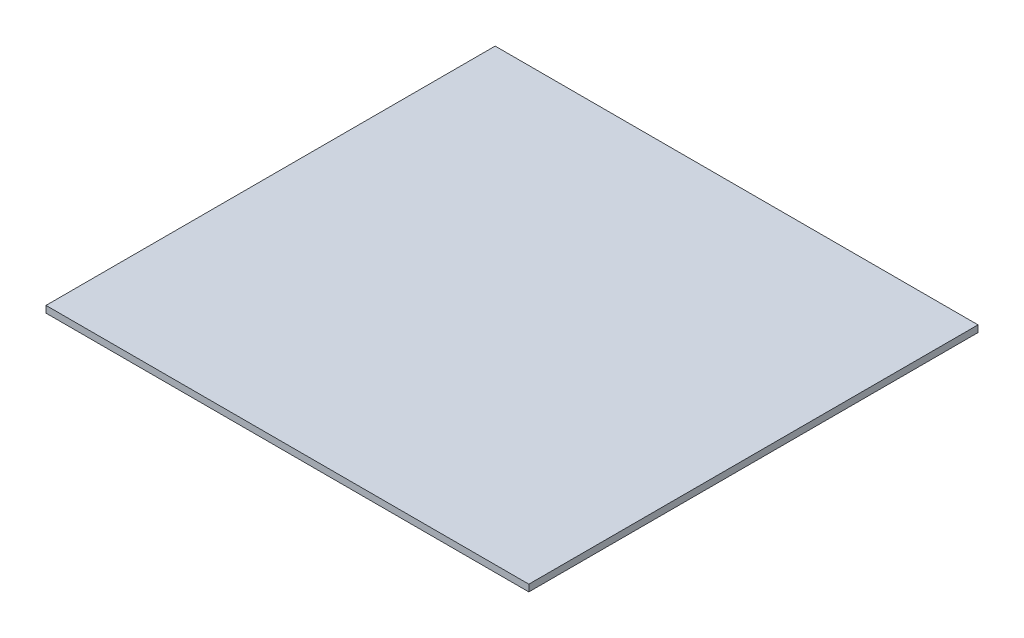
ISO-10303-21;
HEADER;
FILE_DESCRIPTION(('STEP AP214'),'2;1');
FILE_NAME('part.step','',(''),(''),'','','');
FILE_SCHEMA(('AUTOMOTIVE_DESIGN { 1 0 10303 214 1 1 1 1 }'));
ENDSEC;
DATA;
#1=APPLICATION_CONTEXT('core data for automotive mechanical design processes');
#2=APPLICATION_PROTOCOL_DEFINITION('international standard','automotive_design',2000,#1);
#3=PRODUCT_CONTEXT('',#1,'mechanical');
#4=PRODUCT('Part','Part','',(#3));
#5=PRODUCT_RELATED_PRODUCT_CATEGORY('part','',(#4));
#6=PRODUCT_DEFINITION_FORMATION('','',#4);
#7=PRODUCT_DEFINITION_CONTEXT('part definition',#1,'design');
#8=PRODUCT_DEFINITION('design','',#6,#7);
#9=PRODUCT_DEFINITION_SHAPE('','',#8);
#10=(LENGTH_UNIT() NAMED_UNIT(*) SI_UNIT(.MILLI.,.METRE.));
#11=(NAMED_UNIT(*) PLANE_ANGLE_UNIT() SI_UNIT($,.RADIAN.));
#12=(NAMED_UNIT(*) SI_UNIT($,.STERADIAN.) SOLID_ANGLE_UNIT());
#13=UNCERTAINTY_MEASURE_WITH_UNIT(LENGTH_MEASURE(1.E-05),#10,'distance_accuracy_value','');
#14=(GEOMETRIC_REPRESENTATION_CONTEXT(3) GLOBAL_UNCERTAINTY_ASSIGNED_CONTEXT((#13)) GLOBAL_UNIT_ASSIGNED_CONTEXT((#10,
#11,#12)) REPRESENTATION_CONTEXT('',''));
#15=CARTESIAN_POINT('',(0.,0.,0.));
#16=DIRECTION('',(0.,0.,1.));
#17=DIRECTION('',(1.,0.,0.));
#18=AXIS2_PLACEMENT_3D('',#15,#16,#17);
#19=CARTESIAN_POINT('',(215.,3.,200.));
#20=DIRECTION('',(-1.,0.,0.));
#21=DIRECTION('',(0.,0.,1.));
#22=AXIS2_PLACEMENT_3D('',#19,#20,#21);
#23=PLANE('',#22);
#24=DIRECTION('',(0.,0.,-1.));
#25=VECTOR('',#24,1.);
#26=CARTESIAN_POINT('',(215.,-3.,200.));
#27=LINE('',#26,#25);
#28=CARTESIAN_POINT('',(215.,-3.,200.));
#29=VERTEX_POINT('',#28);
#30=CARTESIAN_POINT('',(215.,-3.,-200.));
#31=VERTEX_POINT('',#30);
#32=EDGE_CURVE('E96',#29,#31,#27,.T.);
#33=ORIENTED_EDGE('',*,*,#32,.T.);
#34=DIRECTION('',(0.,-1.,0.));
#35=VECTOR('',#34,1.);
#36=CARTESIAN_POINT('',(215.,3.,-200.));
#37=LINE('',#36,#35);
#38=CARTESIAN_POINT('',(215.,3.,-200.));
#39=VERTEX_POINT('',#38);
#40=EDGE_CURVE('E11',#39,#31,#37,.T.);
#41=ORIENTED_EDGE('',*,*,#40,.F.);
#42=DIRECTION('',(0.,0.,-1.));
#43=VECTOR('',#42,1.);
#44=CARTESIAN_POINT('',(215.,3.,200.));
#45=LINE('',#44,#43);
#46=CARTESIAN_POINT('',(215.,3.,200.));
#47=VERTEX_POINT('',#46);
#48=EDGE_CURVE('E84',#47,#39,#45,.T.);
#49=ORIENTED_EDGE('',*,*,#48,.F.);
#50=DIRECTION('',(0.,-1.,0.));
#51=VECTOR('',#50,1.);
#52=CARTESIAN_POINT('',(215.,3.,200.));
#53=LINE('',#52,#51);
#54=EDGE_CURVE('E92',#47,#29,#53,.T.);
#55=ORIENTED_EDGE('',*,*,#54,.T.);
#56=EDGE_LOOP('',(#33,#41,#49,#55));
#57=FACE_BOUND('',#56,.T.);
#58=ADVANCED_FACE('F33',(#57),#23,.F.);
#59=CARTESIAN_POINT('',(-215.,3.,-200.));
#60=DIRECTION('',(0.,0.,1.));
#61=DIRECTION('',(1.,0.,0.));
#62=AXIS2_PLACEMENT_3D('',#59,#60,#61);
#63=PLANE('',#62);
#64=DIRECTION('',(-1.,0.,0.));
#65=VECTOR('',#64,1.);
#66=CARTESIAN_POINT('',(-215.,-3.,-200.));
#67=LINE('',#66,#65);
#68=CARTESIAN_POINT('',(-215.,-3.,-200.));
#69=VERTEX_POINT('',#68);
#70=EDGE_CURVE('E88',#31,#69,#67,.T.);
#71=ORIENTED_EDGE('',*,*,#70,.T.);
#72=DIRECTION('',(0.,-1.,0.));
#73=VECTOR('',#72,1.);
#74=CARTESIAN_POINT('',(-215.,3.,-200.));
#75=LINE('',#74,#73);
#76=CARTESIAN_POINT('',(-215.,3.,-200.));
#77=VERTEX_POINT('',#76);
#78=EDGE_CURVE('E41',#77,#69,#75,.T.);
#79=ORIENTED_EDGE('',*,*,#78,.F.);
#80=DIRECTION('',(-1.,0.,0.));
#81=VECTOR('',#80,1.);
#82=CARTESIAN_POINT('',(-215.,3.,-200.));
#83=LINE('',#82,#81);
#84=EDGE_CURVE('E79',#39,#77,#83,.T.);
#85=ORIENTED_EDGE('',*,*,#84,.F.);
#86=ORIENTED_EDGE('',*,*,#40,.T.);
#87=EDGE_LOOP('',(#71,#79,#85,#86));
#88=FACE_BOUND('',#87,.T.);
#89=ADVANCED_FACE('F87',(#88),#63,.F.);
#90=CARTESIAN_POINT('',(-215.,3.,200.));
#91=DIRECTION('',(1.,0.,0.));
#92=DIRECTION('',(0.,0.,-1.));
#93=AXIS2_PLACEMENT_3D('',#90,#91,#92);
#94=PLANE('',#93);
#95=DIRECTION('',(0.,0.,1.));
#96=VECTOR('',#95,1.);
#97=CARTESIAN_POINT('',(-215.,-3.,200.));
#98=LINE('',#97,#96);
#99=CARTESIAN_POINT('',(-215.,-3.,200.));
#100=VERTEX_POINT('',#99);
#101=EDGE_CURVE('E66',#69,#100,#98,.T.);
#102=ORIENTED_EDGE('',*,*,#101,.T.);
#103=DIRECTION('',(0.,-1.,0.));
#104=VECTOR('',#103,1.);
#105=CARTESIAN_POINT('',(-215.,3.,200.));
#106=LINE('',#105,#104);
#107=CARTESIAN_POINT('',(-215.,3.,200.));
#108=VERTEX_POINT('',#107);
#109=EDGE_CURVE('E89',#108,#100,#106,.T.);
#110=ORIENTED_EDGE('',*,*,#109,.F.);
#111=DIRECTION('',(0.,0.,1.));
#112=VECTOR('',#111,1.);
#113=CARTESIAN_POINT('',(-215.,3.,200.));
#114=LINE('',#113,#112);
#115=EDGE_CURVE('E82',#77,#108,#114,.T.);
#116=ORIENTED_EDGE('',*,*,#115,.F.);
#117=ORIENTED_EDGE('',*,*,#78,.T.);
#118=EDGE_LOOP('',(#102,#110,#116,#117));
#119=FACE_BOUND('',#118,.T.);
#120=ADVANCED_FACE('F90',(#119),#94,.F.);
#121=CARTESIAN_POINT('',(-215.,3.,200.));
#122=DIRECTION('',(0.,0.,-1.));
#123=DIRECTION('',(-1.,0.,0.));
#124=AXIS2_PLACEMENT_3D('',#121,#122,#123);
#125=PLANE('',#124);
#126=DIRECTION('',(1.,0.,0.));
#127=VECTOR('',#126,1.);
#128=CARTESIAN_POINT('',(-215.,-3.,200.));
#129=LINE('',#128,#127);
#130=EDGE_CURVE('E72',#100,#29,#129,.T.);
#131=ORIENTED_EDGE('',*,*,#130,.T.);
#132=ORIENTED_EDGE('',*,*,#54,.F.);
#133=DIRECTION('',(1.,0.,0.));
#134=VECTOR('',#133,1.);
#135=CARTESIAN_POINT('',(-215.,3.,200.));
#136=LINE('',#135,#134);
#137=EDGE_CURVE('E49',#108,#47,#136,.T.);
#138=ORIENTED_EDGE('',*,*,#137,.F.);
#139=ORIENTED_EDGE('',*,*,#109,.T.);
#140=EDGE_LOOP('',(#131,#132,#138,#139));
#141=FACE_BOUND('',#140,.T.);
#142=ADVANCED_FACE('F103',(#141),#125,.F.);
#143=CARTESIAN_POINT('',(0.,3.,0.));
#144=DIRECTION('',(0.,-1.,0.));
#145=DIRECTION('',(0.,0.,-1.));
#146=AXIS2_PLACEMENT_3D('',#143,#144,#145);
#147=PLANE('',#146);
#148=ORIENTED_EDGE('',*,*,#48,.T.);
#149=ORIENTED_EDGE('',*,*,#84,.T.);
#150=ORIENTED_EDGE('',*,*,#115,.T.);
#151=ORIENTED_EDGE('',*,*,#137,.T.);
#152=EDGE_LOOP('',(#148,#149,#150,#151));
#153=FACE_BOUND('',#152,.T.);
#154=ADVANCED_FACE('F80',(#153),#147,.F.);
#155=CARTESIAN_POINT('',(0.,-3.,0.));
#156=DIRECTION('',(0.,-1.,0.));
#157=DIRECTION('',(0.,0.,-1.));
#158=AXIS2_PLACEMENT_3D('',#155,#156,#157);
#159=PLANE('',#158);
#160=ORIENTED_EDGE('',*,*,#32,.F.);
#161=ORIENTED_EDGE('',*,*,#130,.F.);
#162=ORIENTED_EDGE('',*,*,#101,.F.);
#163=ORIENTED_EDGE('',*,*,#70,.F.);
#164=EDGE_LOOP('',(#160,#161,#162,#163));
#165=FACE_BOUND('',#164,.T.);
#166=ADVANCED_FACE('F106',(#165),#159,.T.);
#167=CLOSED_SHELL('',(#58,#89,#120,#142,#154,#166));
#168=MANIFOLD_SOLID_BREP('B2',#167);
#169=ADVANCED_BREP_SHAPE_REPRESENTATION('',(#18,#168),#14);
#170=SHAPE_DEFINITION_REPRESENTATION(#9,#169);
ENDSEC;
END-ISO-10303-21;
